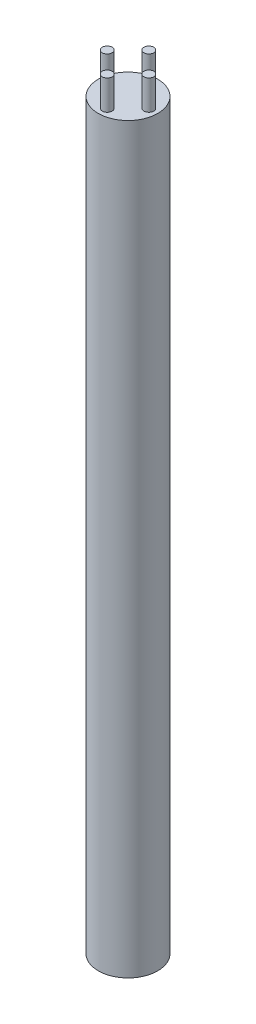
ISO-10303-21;
HEADER;
FILE_DESCRIPTION(('STEP AP214'),'2;1');
FILE_NAME('part.step','',(''),(''),'','','');
FILE_SCHEMA(('AUTOMOTIVE_DESIGN { 1 0 10303 214 1 1 1 1 }'));
ENDSEC;
DATA;
#1=APPLICATION_CONTEXT('core data for automotive mechanical design processes');
#2=APPLICATION_PROTOCOL_DEFINITION('international standard','automotive_design',2000,#1);
#3=PRODUCT_CONTEXT('',#1,'mechanical');
#4=PRODUCT('Part','Part','',(#3));
#5=PRODUCT_RELATED_PRODUCT_CATEGORY('part','',(#4));
#6=PRODUCT_DEFINITION_FORMATION('','',#4);
#7=PRODUCT_DEFINITION_CONTEXT('part definition',#1,'design');
#8=PRODUCT_DEFINITION('design','',#6,#7);
#9=PRODUCT_DEFINITION_SHAPE('','',#8);
#10=(LENGTH_UNIT() NAMED_UNIT(*) SI_UNIT(.MILLI.,.METRE.));
#11=(NAMED_UNIT(*) PLANE_ANGLE_UNIT() SI_UNIT($,.RADIAN.));
#12=(NAMED_UNIT(*) SI_UNIT($,.STERADIAN.) SOLID_ANGLE_UNIT());
#13=UNCERTAINTY_MEASURE_WITH_UNIT(LENGTH_MEASURE(1.E-05),#10,'distance_accuracy_value','');
#14=(GEOMETRIC_REPRESENTATION_CONTEXT(3) GLOBAL_UNCERTAINTY_ASSIGNED_CONTEXT((#13)) GLOBAL_UNIT_ASSIGNED_CONTEXT((#10,
#11,#12)) REPRESENTATION_CONTEXT('',''));
#15=CARTESIAN_POINT('',(0.,0.,0.));
#16=DIRECTION('',(0.,0.,1.));
#17=DIRECTION('',(1.,0.,0.));
#18=AXIS2_PLACEMENT_3D('',#15,#16,#17);
#19=CARTESIAN_POINT('',(0.,0.,0.));
#20=DIRECTION('',(0.,-1.,0.));
#21=DIRECTION('',(0.,0.,-1.));
#22=AXIS2_PLACEMENT_3D('',#19,#20,#21);
#23=CYLINDRICAL_SURFACE('',#22,10.);
#24=CARTESIAN_POINT('',(0.,300.,0.));
#25=DIRECTION('',(0.,-1.,0.));
#26=DIRECTION('',(0.,0.,-1.));
#27=AXIS2_PLACEMENT_3D('',#24,#25,#26);
#28=CIRCLE('',#27,10.);
#29=CARTESIAN_POINT('',(0.,300.,-10.));
#30=VERTEX_POINT('',#29);
#31=EDGE_CURVE('E53',#30,#30,#28,.T.);
#32=ORIENTED_EDGE('',*,*,#31,.T.);
#33=EDGE_LOOP('',(#32));
#34=FACE_BOUND('',#33,.T.);
#35=CARTESIAN_POINT('',(0.,50.,0.));
#36=DIRECTION('',(0.,-1.,0.));
#37=DIRECTION('',(0.,0.,-1.));
#38=AXIS2_PLACEMENT_3D('',#35,#36,#37);
#39=CIRCLE('',#38,10.);
#40=CARTESIAN_POINT('',(0.,50.,-10.));
#41=VERTEX_POINT('',#40);
#42=EDGE_CURVE('E68',#41,#41,#39,.T.);
#43=ORIENTED_EDGE('',*,*,#42,.F.);
#44=EDGE_LOOP('',(#43));
#45=FACE_BOUND('',#44,.T.);
#46=ADVANCED_FACE('F34',(#34,#45),#23,.T.);
#47=CARTESIAN_POINT('',(0.,300.,0.));
#48=DIRECTION('',(0.,-1.,0.));
#49=DIRECTION('',(0.,0.,-1.));
#50=AXIS2_PLACEMENT_3D('',#47,#48,#49);
#51=PLANE('',#50);
#52=CARTESIAN_POINT('',(0.,300.,-7.));
#53=DIRECTION('',(0.,-1.,0.));
#54=DIRECTION('',(0.,0.,-1.));
#55=AXIS2_PLACEMENT_3D('',#52,#53,#54);
#56=CIRCLE('',#55,1.65);
#57=CARTESIAN_POINT('',(0.,300.,-8.65));
#58=VERTEX_POINT('',#57);
#59=EDGE_CURVE('E10',#58,#58,#56,.F.);
#60=ORIENTED_EDGE('',*,*,#59,.F.);
#61=EDGE_LOOP('',(#60));
#62=FACE_BOUND('',#61,.T.);
#63=CARTESIAN_POINT('',(-7.,300.,1.96380207734619E-13));
#64=DIRECTION('',(0.,-1.,0.));
#65=DIRECTION('',(0.,0.,-1.));
#66=AXIS2_PLACEMENT_3D('',#63,#64,#65);
#67=CIRCLE('',#66,1.64999999999993);
#68=CARTESIAN_POINT('',(-7.,300.,-1.64999999999973));
#69=VERTEX_POINT('',#68);
#70=EDGE_CURVE('E40',#69,#69,#67,.F.);
#71=ORIENTED_EDGE('',*,*,#70,.F.);
#72=EDGE_LOOP('',(#71));
#73=FACE_BOUND('',#72,.T.);
#74=CARTESIAN_POINT('',(0.,300.,7.));
#75=DIRECTION('',(0.,-1.,0.));
#76=DIRECTION('',(0.,0.,-1.));
#77=AXIS2_PLACEMENT_3D('',#74,#75,#76);
#78=CIRCLE('',#77,1.65);
#79=CARTESIAN_POINT('',(0.,300.,5.35));
#80=VERTEX_POINT('',#79);
#81=EDGE_CURVE('E44',#80,#80,#78,.F.);
#82=ORIENTED_EDGE('',*,*,#81,.F.);
#83=EDGE_LOOP('',(#82));
#84=FACE_BOUND('',#83,.T.);
#85=CARTESIAN_POINT('',(7.,300.,0.));
#86=DIRECTION('',(0.,-1.,0.));
#87=DIRECTION('',(0.,0.,-1.));
#88=AXIS2_PLACEMENT_3D('',#85,#86,#87);
#89=CIRCLE('',#88,1.65);
#90=CARTESIAN_POINT('',(7.,300.,-1.65));
#91=VERTEX_POINT('',#90);
#92=EDGE_CURVE('E48',#91,#91,#89,.F.);
#93=ORIENTED_EDGE('',*,*,#92,.F.);
#94=EDGE_LOOP('',(#93));
#95=FACE_BOUND('',#94,.T.);
#96=ORIENTED_EDGE('',*,*,#31,.F.);
#97=EDGE_LOOP('',(#96));
#98=FACE_BOUND('',#97,.T.);
#99=ADVANCED_FACE('F75',(#62,#73,#84,#95,#98),#51,.F.);
#100=CARTESIAN_POINT('',(7.,310.,0.));
#101=DIRECTION('',(0.,-1.,0.));
#102=DIRECTION('',(0.,0.,-1.));
#103=AXIS2_PLACEMENT_3D('',#100,#101,#102);
#104=CYLINDRICAL_SURFACE('',#103,1.65);
#105=CARTESIAN_POINT('',(7.,310.,0.));
#106=DIRECTION('',(0.,1.,0.));
#107=DIRECTION('',(0.,0.,1.));
#108=AXIS2_PLACEMENT_3D('',#105,#106,#107);
#109=CIRCLE('',#108,1.65);
#110=CARTESIAN_POINT('',(7.,310.,1.65));
#111=VERTEX_POINT('',#110);
#112=EDGE_CURVE('E56',#111,#111,#109,.T.);
#113=ORIENTED_EDGE('',*,*,#112,.F.);
#114=EDGE_LOOP('',(#113));
#115=FACE_BOUND('',#114,.T.);
#116=ORIENTED_EDGE('',*,*,#92,.T.);
#117=EDGE_LOOP('',(#116));
#118=FACE_BOUND('',#117,.T.);
#119=ADVANCED_FACE('F80',(#115,#118),#104,.T.);
#120=CARTESIAN_POINT('',(7.,310.,0.));
#121=DIRECTION('',(0.,1.,0.));
#122=DIRECTION('',(0.,0.,1.));
#123=AXIS2_PLACEMENT_3D('',#120,#121,#122);
#124=PLANE('',#123);
#125=ORIENTED_EDGE('',*,*,#112,.T.);
#126=EDGE_LOOP('',(#125));
#127=FACE_BOUND('',#126,.T.);
#128=ADVANCED_FACE('F87',(#127),#124,.T.);
#129=CARTESIAN_POINT('',(0.,310.,7.));
#130=DIRECTION('',(0.,-1.,0.));
#131=DIRECTION('',(0.,0.,-1.));
#132=AXIS2_PLACEMENT_3D('',#129,#130,#131);
#133=CYLINDRICAL_SURFACE('',#132,1.65);
#134=CARTESIAN_POINT('',(0.,310.,7.));
#135=DIRECTION('',(0.,1.,0.));
#136=DIRECTION('',(0.,0.,1.));
#137=AXIS2_PLACEMENT_3D('',#134,#135,#136);
#138=CIRCLE('',#137,1.65);
#139=CARTESIAN_POINT('',(0.,310.,8.65));
#140=VERTEX_POINT('',#139);
#141=EDGE_CURVE('E59',#140,#140,#138,.T.);
#142=ORIENTED_EDGE('',*,*,#141,.F.);
#143=EDGE_LOOP('',(#142));
#144=FACE_BOUND('',#143,.T.);
#145=ORIENTED_EDGE('',*,*,#81,.T.);
#146=EDGE_LOOP('',(#145));
#147=FACE_BOUND('',#146,.T.);
#148=ADVANCED_FACE('F94',(#144,#147),#133,.T.);
#149=CARTESIAN_POINT('',(0.,310.,7.));
#150=DIRECTION('',(0.,1.,0.));
#151=DIRECTION('',(0.,0.,1.));
#152=AXIS2_PLACEMENT_3D('',#149,#150,#151);
#153=PLANE('',#152);
#154=ORIENTED_EDGE('',*,*,#141,.T.);
#155=EDGE_LOOP('',(#154));
#156=FACE_BOUND('',#155,.T.);
#157=ADVANCED_FACE('F98',(#156),#153,.T.);
#158=CARTESIAN_POINT('',(-7.,310.,1.96380207734619E-13));
#159=DIRECTION('',(0.,-1.,0.));
#160=DIRECTION('',(0.,0.,-1.));
#161=AXIS2_PLACEMENT_3D('',#158,#159,#160);
#162=CYLINDRICAL_SURFACE('',#161,1.64999999999993);
#163=CARTESIAN_POINT('',(-7.,310.,1.96380207734619E-13));
#164=DIRECTION('',(0.,1.,0.));
#165=DIRECTION('',(0.,0.,1.));
#166=AXIS2_PLACEMENT_3D('',#163,#164,#165);
#167=CIRCLE('',#166,1.64999999999993);
#168=CARTESIAN_POINT('',(-7.,310.,1.65000000000012));
#169=VERTEX_POINT('',#168);
#170=EDGE_CURVE('E62',#169,#169,#167,.T.);
#171=ORIENTED_EDGE('',*,*,#170,.F.);
#172=EDGE_LOOP('',(#171));
#173=FACE_BOUND('',#172,.T.);
#174=ORIENTED_EDGE('',*,*,#70,.T.);
#175=EDGE_LOOP('',(#174));
#176=FACE_BOUND('',#175,.T.);
#177=ADVANCED_FACE('F102',(#173,#176),#162,.T.);
#178=CARTESIAN_POINT('',(-7.,310.,1.96380207734619E-13));
#179=DIRECTION('',(0.,1.,0.));
#180=DIRECTION('',(0.,0.,1.));
#181=AXIS2_PLACEMENT_3D('',#178,#179,#180);
#182=PLANE('',#181);
#183=ORIENTED_EDGE('',*,*,#170,.T.);
#184=EDGE_LOOP('',(#183));
#185=FACE_BOUND('',#184,.T.);
#186=ADVANCED_FACE('F106',(#185),#182,.T.);
#187=CARTESIAN_POINT('',(0.,310.,-7.));
#188=DIRECTION('',(0.,-1.,0.));
#189=DIRECTION('',(0.,0.,-1.));
#190=AXIS2_PLACEMENT_3D('',#187,#188,#189);
#191=CYLINDRICAL_SURFACE('',#190,1.65);
#192=CARTESIAN_POINT('',(0.,310.,-7.));
#193=DIRECTION('',(0.,1.,0.));
#194=DIRECTION('',(0.,0.,1.));
#195=AXIS2_PLACEMENT_3D('',#192,#193,#194);
#196=CIRCLE('',#195,1.65);
#197=CARTESIAN_POINT('',(0.,310.,-5.35));
#198=VERTEX_POINT('',#197);
#199=EDGE_CURVE('E65',#198,#198,#196,.T.);
#200=ORIENTED_EDGE('',*,*,#199,.F.);
#201=EDGE_LOOP('',(#200));
#202=FACE_BOUND('',#201,.T.);
#203=ORIENTED_EDGE('',*,*,#59,.T.);
#204=EDGE_LOOP('',(#203));
#205=FACE_BOUND('',#204,.T.);
#206=ADVANCED_FACE('F110',(#202,#205),#191,.T.);
#207=CARTESIAN_POINT('',(0.,310.,-7.));
#208=DIRECTION('',(0.,1.,0.));
#209=DIRECTION('',(0.,0.,1.));
#210=AXIS2_PLACEMENT_3D('',#207,#208,#209);
#211=PLANE('',#210);
#212=ORIENTED_EDGE('',*,*,#199,.T.);
#213=EDGE_LOOP('',(#212));
#214=FACE_BOUND('',#213,.T.);
#215=ADVANCED_FACE('F114',(#214),#211,.T.);
#216=CARTESIAN_POINT('',(0.,50.,0.));
#217=DIRECTION('',(0.,-1.,0.));
#218=DIRECTION('',(0.,0.,-1.));
#219=AXIS2_PLACEMENT_3D('',#216,#217,#218);
#220=PLANE('',#219);
#221=ORIENTED_EDGE('',*,*,#42,.T.);
#222=EDGE_LOOP('',(#221));
#223=FACE_BOUND('',#222,.T.);
#224=ADVANCED_FACE('F72',(#223),#220,.T.);
#225=CLOSED_SHELL('',(#46,#99,#119,#128,#148,#157,#177,#186,#206,#215,#224));
#226=MANIFOLD_SOLID_BREP('B2',#225);
#227=ADVANCED_BREP_SHAPE_REPRESENTATION('',(#18,#226),#14);
#228=SHAPE_DEFINITION_REPRESENTATION(#9,#227);
ENDSEC;
END-ISO-10303-21;
